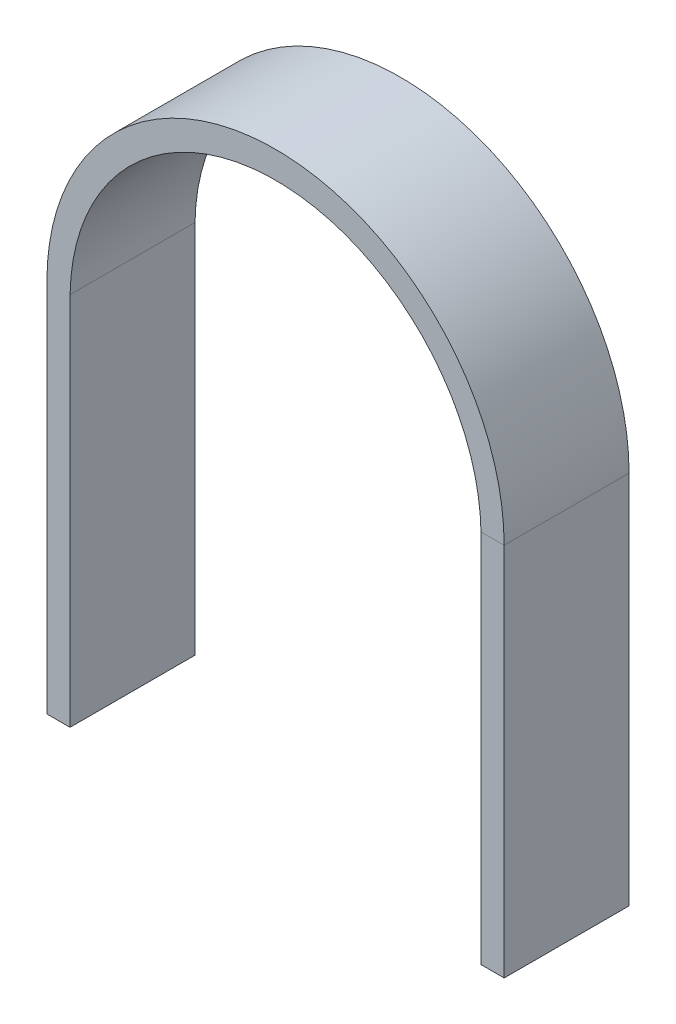
ISO-10303-21;
HEADER;
FILE_DESCRIPTION(('STEP AP214'),'2;1');
FILE_NAME('part.step','',(''),(''),'','','');
FILE_SCHEMA(('AUTOMOTIVE_DESIGN { 1 0 10303 214 1 1 1 1 }'));
ENDSEC;
DATA;
#1=APPLICATION_CONTEXT('core data for automotive mechanical design processes');
#2=APPLICATION_PROTOCOL_DEFINITION('international standard','automotive_design',2000,#1);
#3=PRODUCT_CONTEXT('',#1,'mechanical');
#4=PRODUCT('Part','Part','',(#3));
#5=PRODUCT_RELATED_PRODUCT_CATEGORY('part','',(#4));
#6=PRODUCT_DEFINITION_FORMATION('','',#4);
#7=PRODUCT_DEFINITION_CONTEXT('part definition',#1,'design');
#8=PRODUCT_DEFINITION('design','',#6,#7);
#9=PRODUCT_DEFINITION_SHAPE('','',#8);
#10=(LENGTH_UNIT() NAMED_UNIT(*) SI_UNIT(.MILLI.,.METRE.));
#11=(NAMED_UNIT(*) PLANE_ANGLE_UNIT() SI_UNIT($,.RADIAN.));
#12=(NAMED_UNIT(*) SI_UNIT($,.STERADIAN.) SOLID_ANGLE_UNIT());
#13=UNCERTAINTY_MEASURE_WITH_UNIT(LENGTH_MEASURE(1.E-05),#10,'distance_accuracy_value','');
#14=(GEOMETRIC_REPRESENTATION_CONTEXT(3) GLOBAL_UNCERTAINTY_ASSIGNED_CONTEXT((#13)) GLOBAL_UNIT_ASSIGNED_CONTEXT((#10,
#11,#12)) REPRESENTATION_CONTEXT('',''));
#15=CARTESIAN_POINT('',(0.,0.,0.));
#16=DIRECTION('',(0.,0.,1.));
#17=DIRECTION('',(1.,0.,0.));
#18=AXIS2_PLACEMENT_3D('',#15,#16,#17);
#19=CARTESIAN_POINT('',(-18.3,30.,-5.));
#20=DIRECTION('',(0.,0.,1.));
#21=DIRECTION('',(1.,0.,0.));
#22=AXIS2_PLACEMENT_3D('',#19,#20,#21);
#23=PLANE('',#22);
#24=DIRECTION('',(0.,-1.,0.));
#25=VECTOR('',#24,1.);
#26=CARTESIAN_POINT('',(16.45,30.,-5.));
#27=LINE('',#26,#25);
#28=CARTESIAN_POINT('',(16.45,30.,-5.));
#29=VERTEX_POINT('',#28);
#30=CARTESIAN_POINT('',(16.45,0.,-5.));
#31=VERTEX_POINT('',#30);
#32=EDGE_CURVE('E12',#29,#31,#27,.T.);
#33=ORIENTED_EDGE('',*,*,#32,.F.);
#34=DIRECTION('',(-1.,0.,0.));
#35=VECTOR('',#34,1.);
#36=CARTESIAN_POINT('',(-18.3,30.,-5.));
#37=LINE('',#36,#35);
#38=CARTESIAN_POINT('',(18.3,30.,-5.));
#39=VERTEX_POINT('',#38);
#40=EDGE_CURVE('E94',#39,#29,#37,.T.);
#41=ORIENTED_EDGE('',*,*,#40,.F.);
#42=DIRECTION('',(0.,-1.,0.));
#43=VECTOR('',#42,1.);
#44=CARTESIAN_POINT('',(18.3,30.,-5.));
#45=LINE('',#44,#43);
#46=CARTESIAN_POINT('',(18.3,0.,-5.));
#47=VERTEX_POINT('',#46);
#48=EDGE_CURVE('E118',#39,#47,#45,.T.);
#49=ORIENTED_EDGE('',*,*,#48,.T.);
#50=DIRECTION('',(-1.,0.,0.));
#51=VECTOR('',#50,1.);
#52=CARTESIAN_POINT('',(-18.3,0.,-5.));
#53=LINE('',#52,#51);
#54=EDGE_CURVE('E48',#47,#31,#53,.T.);
#55=ORIENTED_EDGE('',*,*,#54,.T.);
#56=EDGE_LOOP('',(#33,#41,#49,#55));
#57=FACE_BOUND('',#56,.T.);
#58=ADVANCED_FACE('F45',(#57),#23,.F.);
#59=CARTESIAN_POINT('',(-18.3,30.,5.));
#60=DIRECTION('',(0.,0.,-1.));
#61=DIRECTION('',(-1.,0.,0.));
#62=AXIS2_PLACEMENT_3D('',#59,#60,#61);
#63=PLANE('',#62);
#64=DIRECTION('',(0.,-1.,0.));
#65=VECTOR('',#64,1.);
#66=CARTESIAN_POINT('',(16.45,30.,5.));
#67=LINE('',#66,#65);
#68=CARTESIAN_POINT('',(16.45,30.,5.));
#69=VERTEX_POINT('',#68);
#70=CARTESIAN_POINT('',(16.45,0.,5.));
#71=VERTEX_POINT('',#70);
#72=EDGE_CURVE('E79',#69,#71,#67,.T.);
#73=ORIENTED_EDGE('',*,*,#72,.T.);
#74=DIRECTION('',(1.,0.,0.));
#75=VECTOR('',#74,1.);
#76=CARTESIAN_POINT('',(-18.3,0.,5.));
#77=LINE('',#76,#75);
#78=CARTESIAN_POINT('',(18.3,0.,5.));
#79=VERTEX_POINT('',#78);
#80=EDGE_CURVE('E86',#71,#79,#77,.T.);
#81=ORIENTED_EDGE('',*,*,#80,.T.);
#82=DIRECTION('',(0.,-1.,0.));
#83=VECTOR('',#82,1.);
#84=CARTESIAN_POINT('',(18.3,30.,5.));
#85=LINE('',#84,#83);
#86=CARTESIAN_POINT('',(18.3,30.,5.));
#87=VERTEX_POINT('',#86);
#88=EDGE_CURVE('E95',#87,#79,#85,.T.);
#89=ORIENTED_EDGE('',*,*,#88,.F.);
#90=DIRECTION('',(1.,0.,0.));
#91=VECTOR('',#90,1.);
#92=CARTESIAN_POINT('',(-18.3,30.,5.));
#93=LINE('',#92,#91);
#94=EDGE_CURVE('E92',#69,#87,#93,.T.);
#95=ORIENTED_EDGE('',*,*,#94,.F.);
#96=EDGE_LOOP('',(#73,#81,#89,#95));
#97=FACE_BOUND('',#96,.T.);
#98=ADVANCED_FACE('F97',(#97),#63,.F.);
#99=CARTESIAN_POINT('',(0.,30.,0.));
#100=DIRECTION('',(0.,1.,0.));
#101=DIRECTION('',(0.,0.,1.));
#102=AXIS2_PLACEMENT_3D('',#99,#100,#101);
#103=PLANE('',#102);
#104=ORIENTED_EDGE('',*,*,#40,.T.);
#105=DIRECTION('',(0.,0.,-1.));
#106=VECTOR('',#105,1.);
#107=CARTESIAN_POINT('',(16.45,30.,-5.));
#108=LINE('',#107,#106);
#109=EDGE_CURVE('E54',#69,#29,#108,.T.);
#110=ORIENTED_EDGE('',*,*,#109,.F.);
#111=ORIENTED_EDGE('',*,*,#94,.T.);
#112=DIRECTION('',(0.,0.,-1.));
#113=VECTOR('',#112,1.);
#114=CARTESIAN_POINT('',(18.3,30.,-5.));
#115=LINE('',#114,#113);
#116=EDGE_CURVE('E100',#87,#39,#115,.T.);
#117=ORIENTED_EDGE('',*,*,#116,.T.);
#118=EDGE_LOOP('',(#104,#110,#111,#117));
#119=FACE_BOUND('',#118,.T.);
#120=ADVANCED_FACE('F90',(#119),#103,.T.);
#121=CARTESIAN_POINT('',(0.,0.,0.));
#122=DIRECTION('',(0.,1.,0.));
#123=DIRECTION('',(0.,0.,1.));
#124=AXIS2_PLACEMENT_3D('',#121,#122,#123);
#125=PLANE('',#124);
#126=DIRECTION('',(0.,0.,-1.));
#127=VECTOR('',#126,1.);
#128=CARTESIAN_POINT('',(16.45,0.,-5.));
#129=LINE('',#128,#127);
#130=EDGE_CURVE('E82',#71,#31,#129,.T.);
#131=ORIENTED_EDGE('',*,*,#130,.T.);
#132=ORIENTED_EDGE('',*,*,#54,.F.);
#133=DIRECTION('',(0.,0.,-1.));
#134=VECTOR('',#133,1.);
#135=CARTESIAN_POINT('',(18.3,0.,-5.));
#136=LINE('',#135,#134);
#137=EDGE_CURVE('E111',#79,#47,#136,.T.);
#138=ORIENTED_EDGE('',*,*,#137,.F.);
#139=ORIENTED_EDGE('',*,*,#80,.F.);
#140=EDGE_LOOP('',(#131,#132,#138,#139));
#141=FACE_BOUND('',#140,.T.);
#142=ADVANCED_FACE('F113',(#141),#125,.F.);
#143=CARTESIAN_POINT('',(18.3,30.,-5.));
#144=DIRECTION('',(-1.,0.,0.));
#145=DIRECTION('',(0.,0.,1.));
#146=AXIS2_PLACEMENT_3D('',#143,#144,#145);
#147=PLANE('',#146);
#148=ORIENTED_EDGE('',*,*,#137,.T.);
#149=ORIENTED_EDGE('',*,*,#48,.F.);
#150=ORIENTED_EDGE('',*,*,#116,.F.);
#151=ORIENTED_EDGE('',*,*,#88,.T.);
#152=EDGE_LOOP('',(#148,#149,#150,#151));
#153=FACE_BOUND('',#152,.T.);
#154=ADVANCED_FACE('F109',(#153),#147,.F.);
#155=CARTESIAN_POINT('',(16.45,30.,-5.));
#156=DIRECTION('',(-1.,0.,0.));
#157=DIRECTION('',(0.,0.,1.));
#158=AXIS2_PLACEMENT_3D('',#155,#156,#157);
#159=PLANE('',#158);
#160=ORIENTED_EDGE('',*,*,#130,.F.);
#161=ORIENTED_EDGE('',*,*,#72,.F.);
#162=ORIENTED_EDGE('',*,*,#109,.T.);
#163=ORIENTED_EDGE('',*,*,#32,.T.);
#164=EDGE_LOOP('',(#160,#161,#162,#163));
#165=FACE_BOUND('',#164,.T.);
#166=ADVANCED_FACE('F81',(#165),#159,.T.);
#167=CLOSED_SHELL('',(#58,#98,#120,#142,#154,#166));
#168=MANIFOLD_SOLID_BREP('B2',#167);
#169=CARTESIAN_POINT('',(-18.3,30.,-45.9200439882462));
#170=DIRECTION('',(0.,-1.,0.));
#171=DIRECTION('',(0.,0.,-1.));
#172=AXIS2_PLACEMENT_3D('',#169,#170,#171);
#173=PLANE('',#172);
#174=DIRECTION('',(0.,0.,1.));
#175=VECTOR('',#174,1.);
#176=CARTESIAN_POINT('',(16.4473898617706,30.,-12.038));
#177=LINE('',#176,#175);
#178=CARTESIAN_POINT('',(16.4473898617706,30.,-5.));
#179=VERTEX_POINT('',#178);
#180=CARTESIAN_POINT('',(16.4473898617706,30.,5.));
#181=VERTEX_POINT('',#180);
#182=EDGE_CURVE('E43',#179,#181,#177,.T.);
#183=ORIENTED_EDGE('',*,*,#182,.F.);
#184=DIRECTION('',(-1.,0.,0.));
#185=VECTOR('',#184,1.);
#186=CARTESIAN_POINT('',(-18.3,30.,-5.));
#187=LINE('',#186,#185);
#188=CARTESIAN_POINT('',(18.3,30.,-5.));
#189=VERTEX_POINT('',#188);
#190=EDGE_CURVE('E246',#189,#179,#187,.T.);
#191=ORIENTED_EDGE('',*,*,#190,.F.);
#192=DIRECTION('',(0.,0.,1.));
#193=VECTOR('',#192,1.);
#194=CARTESIAN_POINT('',(18.3,30.,-45.9200439882462));
#195=LINE('',#194,#193);
#196=CARTESIAN_POINT('',(18.3,30.,5.));
#197=VERTEX_POINT('',#196);
#198=EDGE_CURVE('E237',#189,#197,#195,.T.);
#199=ORIENTED_EDGE('',*,*,#198,.T.);
#200=DIRECTION('',(1.,0.,0.));
#201=VECTOR('',#200,1.);
#202=CARTESIAN_POINT('',(-18.3,30.,5.));
#203=LINE('',#202,#201);
#204=EDGE_CURVE('E232',#181,#197,#203,.T.);
#205=ORIENTED_EDGE('',*,*,#204,.F.);
#206=EDGE_LOOP('',(#183,#191,#199,#205));
#207=FACE_BOUND('',#206,.T.);
#208=ADVANCED_FACE('F163',(#207),#173,.T.);
#209=CARTESIAN_POINT('',(-18.3,30.,-5.));
#210=DIRECTION('',(1.,0.,0.));
#211=DIRECTION('',(0.,0.,-1.));
#212=AXIS2_PLACEMENT_3D('',#209,#210,#211);
#213=PLANE('',#212);
#214=DIRECTION('',(0.,0.,1.));
#215=VECTOR('',#214,1.);
#216=CARTESIAN_POINT('',(-18.3,0.,-5.));
#217=LINE('',#216,#215);
#218=CARTESIAN_POINT('',(-18.3,0.,-5.));
#219=VERTEX_POINT('',#218);
#220=CARTESIAN_POINT('',(-18.3,0.,5.));
#221=VERTEX_POINT('',#220);
#222=EDGE_CURVE('E262',#219,#221,#217,.T.);
#223=ORIENTED_EDGE('',*,*,#222,.T.);
#224=DIRECTION('',(0.,-1.,0.));
#225=VECTOR('',#224,1.);
#226=CARTESIAN_POINT('',(-18.3,30.,5.));
#227=LINE('',#226,#225);
#228=CARTESIAN_POINT('',(-18.3,30.,5.));
#229=VERTEX_POINT('',#228);
#230=EDGE_CURVE('E259',#229,#221,#227,.T.);
#231=ORIENTED_EDGE('',*,*,#230,.F.);
#232=DIRECTION('',(0.,0.,1.));
#233=VECTOR('',#232,1.);
#234=CARTESIAN_POINT('',(-18.3,30.,-5.));
#235=LINE('',#234,#233);
#236=CARTESIAN_POINT('',(-18.3,30.,-5.));
#237=VERTEX_POINT('',#236);
#238=EDGE_CURVE('E257',#237,#229,#235,.T.);
#239=ORIENTED_EDGE('',*,*,#238,.F.);
#240=DIRECTION('',(0.,-1.,0.));
#241=VECTOR('',#240,1.);
#242=CARTESIAN_POINT('',(-18.3,30.,-5.));
#243=LINE('',#242,#241);
#244=EDGE_CURVE('E268',#237,#219,#243,.T.);
#245=ORIENTED_EDGE('',*,*,#244,.T.);
#246=EDGE_LOOP('',(#223,#231,#239,#245));
#247=FACE_BOUND('',#246,.T.);
#248=ADVANCED_FACE('F284',(#247),#213,.F.);
#249=CARTESIAN_POINT('',(0.,0.,0.));
#250=DIRECTION('',(0.,1.,0.));
#251=DIRECTION('',(0.,0.,1.));
#252=AXIS2_PLACEMENT_3D('',#249,#250,#251);
#253=PLANE('',#252);
#254=DIRECTION('',(0.,0.,1.));
#255=VECTOR('',#254,1.);
#256=CARTESIAN_POINT('',(-16.45,0.,-5.));
#257=LINE('',#256,#255);
#258=CARTESIAN_POINT('',(-16.45,0.,-5.));
#259=VERTEX_POINT('',#258);
#260=CARTESIAN_POINT('',(-16.45,0.,5.));
#261=VERTEX_POINT('',#260);
#262=EDGE_CURVE('E248',#259,#261,#257,.T.);
#263=ORIENTED_EDGE('',*,*,#262,.T.);
#264=DIRECTION('',(1.,0.,0.));
#265=VECTOR('',#264,1.);
#266=CARTESIAN_POINT('',(-18.3,0.,5.));
#267=LINE('',#266,#265);
#268=EDGE_CURVE('E260',#221,#261,#267,.T.);
#269=ORIENTED_EDGE('',*,*,#268,.F.);
#270=ORIENTED_EDGE('',*,*,#222,.F.);
#271=DIRECTION('',(-1.,0.,0.));
#272=VECTOR('',#271,1.);
#273=CARTESIAN_POINT('',(-18.3,0.,-5.));
#274=LINE('',#273,#272);
#275=EDGE_CURVE('E256',#259,#219,#274,.T.);
#276=ORIENTED_EDGE('',*,*,#275,.F.);
#277=EDGE_LOOP('',(#263,#269,#270,#276));
#278=FACE_BOUND('',#277,.T.);
#279=ADVANCED_FACE('F288',(#278),#253,.F.);
#280=CARTESIAN_POINT('',(-18.3,30.,5.));
#281=DIRECTION('',(0.,0.,-1.));
#282=DIRECTION('',(-1.,0.,0.));
#283=AXIS2_PLACEMENT_3D('',#280,#281,#282);
#284=PLANE('',#283);
#285=CARTESIAN_POINT('',(-16.45,30.,5.));
#286=VERTEX_POINT('',#285);
#287=CARTESIAN_POINT('',(-16.4473898617706,30.,5.));
#288=VERTEX_POINT('',#287);
#289=EDGE_CURVE('E234',#286,#288,#203,.T.);
#290=ORIENTED_EDGE('',*,*,#289,.T.);
#291=CARTESIAN_POINT('',(0.,29.7069697371821,5.));
#292=DIRECTION('',(0.,0.,1.));
#293=DIRECTION('',(-1.,0.,0.));
#294=AXIS2_PLACEMENT_3D('',#291,#292,#293);
#295=CIRCLE('',#294,16.45);
#296=EDGE_CURVE('E177',#181,#288,#295,.T.);
#297=ORIENTED_EDGE('',*,*,#296,.F.);
#298=ORIENTED_EDGE('',*,*,#204,.T.);
#299=CARTESIAN_POINT('',(0.,30.,5.));
#300=DIRECTION('',(0.,0.,1.));
#301=DIRECTION('',(-1.,0.,0.));
#302=AXIS2_PLACEMENT_3D('',#299,#300,#301);
#303=CIRCLE('',#302,18.3);
#304=EDGE_CURVE('E239',#197,#229,#303,.T.);
#305=ORIENTED_EDGE('',*,*,#304,.T.);
#306=ORIENTED_EDGE('',*,*,#230,.T.);
#307=ORIENTED_EDGE('',*,*,#268,.T.);
#308=DIRECTION('',(0.,-1.,0.));
#309=VECTOR('',#308,1.);
#310=CARTESIAN_POINT('',(-16.45,30.,5.));
#311=LINE('',#310,#309);
#312=EDGE_CURVE('E185',#286,#261,#311,.T.);
#313=ORIENTED_EDGE('',*,*,#312,.F.);
#314=EDGE_LOOP('',(#290,#297,#298,#305,#306,#307,#313));
#315=FACE_BOUND('',#314,.T.);
#316=ADVANCED_FACE('F230',(#315),#284,.F.);
#317=CARTESIAN_POINT('',(-18.3,30.,-5.));
#318=DIRECTION('',(0.,0.,1.));
#319=DIRECTION('',(1.,0.,0.));
#320=AXIS2_PLACEMENT_3D('',#317,#318,#319);
#321=PLANE('',#320);
#322=ORIENTED_EDGE('',*,*,#190,.T.);
#323=CARTESIAN_POINT('',(0.,29.7069697371821,-5.));
#324=DIRECTION('',(0.,0.,1.));
#325=DIRECTION('',(1.,0.,0.));
#326=AXIS2_PLACEMENT_3D('',#323,#324,#325);
#327=CIRCLE('',#326,16.45);
#328=CARTESIAN_POINT('',(-16.4473898617706,30.,-5.));
#329=VERTEX_POINT('',#328);
#330=EDGE_CURVE('E223',#179,#329,#327,.T.);
#331=ORIENTED_EDGE('',*,*,#330,.T.);
#332=CARTESIAN_POINT('',(-16.45,30.,-5.));
#333=VERTEX_POINT('',#332);
#334=EDGE_CURVE('E249',#329,#333,#187,.T.);
#335=ORIENTED_EDGE('',*,*,#334,.T.);
#336=DIRECTION('',(0.,-1.,0.));
#337=VECTOR('',#336,1.);
#338=CARTESIAN_POINT('',(-16.45,30.,-5.));
#339=LINE('',#338,#337);
#340=EDGE_CURVE('E254',#333,#259,#339,.T.);
#341=ORIENTED_EDGE('',*,*,#340,.T.);
#342=ORIENTED_EDGE('',*,*,#275,.T.);
#343=ORIENTED_EDGE('',*,*,#244,.F.);
#344=CARTESIAN_POINT('',(0.,30.,-5.));
#345=DIRECTION('',(0.,0.,1.));
#346=DIRECTION('',(1.,0.,0.));
#347=AXIS2_PLACEMENT_3D('',#344,#345,#346);
#348=CIRCLE('',#347,18.3);
#349=EDGE_CURVE('E245',#237,#189,#348,.F.);
#350=ORIENTED_EDGE('',*,*,#349,.T.);
#351=EDGE_LOOP('',(#322,#331,#335,#341,#342,#343,#350));
#352=FACE_BOUND('',#351,.T.);
#353=ADVANCED_FACE('F165',(#352),#321,.F.);
#354=CARTESIAN_POINT('',(-16.45,30.,-5.));
#355=DIRECTION('',(1.,0.,0.));
#356=DIRECTION('',(0.,0.,-1.));
#357=AXIS2_PLACEMENT_3D('',#354,#355,#356);
#358=PLANE('',#357);
#359=ORIENTED_EDGE('',*,*,#262,.F.);
#360=ORIENTED_EDGE('',*,*,#340,.F.);
#361=DIRECTION('',(0.,0.,1.));
#362=VECTOR('',#361,1.);
#363=CARTESIAN_POINT('',(-16.45,30.,-5.));
#364=LINE('',#363,#362);
#365=EDGE_CURVE('E250',#333,#286,#364,.T.);
#366=ORIENTED_EDGE('',*,*,#365,.T.);
#367=ORIENTED_EDGE('',*,*,#312,.T.);
#368=EDGE_LOOP('',(#359,#360,#366,#367));
#369=FACE_BOUND('',#368,.T.);
#370=ADVANCED_FACE('F289',(#369),#358,.T.);
#371=CARTESIAN_POINT('',(0.,30.,-45.9200439882462));
#372=DIRECTION('',(0.,0.,1.));
#373=DIRECTION('',(1.,0.,0.));
#374=AXIS2_PLACEMENT_3D('',#371,#372,#373);
#375=CYLINDRICAL_SURFACE('',#374,18.3);
#376=ORIENTED_EDGE('',*,*,#349,.F.);
#377=ORIENTED_EDGE('',*,*,#238,.T.);
#378=ORIENTED_EDGE('',*,*,#304,.F.);
#379=ORIENTED_EDGE('',*,*,#198,.F.);
#380=EDGE_LOOP('',(#376,#377,#378,#379));
#381=FACE_BOUND('',#380,.T.);
#382=ADVANCED_FACE('F280',(#381),#375,.T.);
#383=DIRECTION('',(0.,0.,1.));
#384=VECTOR('',#383,1.);
#385=CARTESIAN_POINT('',(-16.4473898617706,30.,-12.038));
#386=LINE('',#385,#384);
#387=EDGE_CURVE('E171',#288,#329,#386,.F.);
#388=ORIENTED_EDGE('',*,*,#387,.F.);
#389=ORIENTED_EDGE('',*,*,#289,.F.);
#390=ORIENTED_EDGE('',*,*,#365,.F.);
#391=ORIENTED_EDGE('',*,*,#334,.F.);
#392=EDGE_LOOP('',(#388,#389,#390,#391));
#393=FACE_BOUND('',#392,.T.);
#394=ADVANCED_FACE('F275',(#393),#173,.T.);
#395=CARTESIAN_POINT('',(0.,29.7069697371821,-12.038));
#396=DIRECTION('',(0.,0.,1.));
#397=DIRECTION('',(1.,0.,0.));
#398=AXIS2_PLACEMENT_3D('',#395,#396,#397);
#399=CYLINDRICAL_SURFACE('',#398,16.45);
#400=ORIENTED_EDGE('',*,*,#182,.T.);
#401=ORIENTED_EDGE('',*,*,#296,.T.);
#402=ORIENTED_EDGE('',*,*,#387,.T.);
#403=ORIENTED_EDGE('',*,*,#330,.F.);
#404=EDGE_LOOP('',(#400,#401,#402,#403));
#405=FACE_BOUND('',#404,.T.);
#406=ADVANCED_FACE('F221',(#405),#399,.F.);
#407=CLOSED_SHELL('',(#208,#248,#279,#316,#353,#370,#382,#394,#406));
#408=MANIFOLD_SOLID_BREP('B6',#407);
#409=ADVANCED_BREP_SHAPE_REPRESENTATION('',(#18,#168,#408),#14);
#410=SHAPE_DEFINITION_REPRESENTATION(#9,#409);
ENDSEC;
END-ISO-10303-21;
